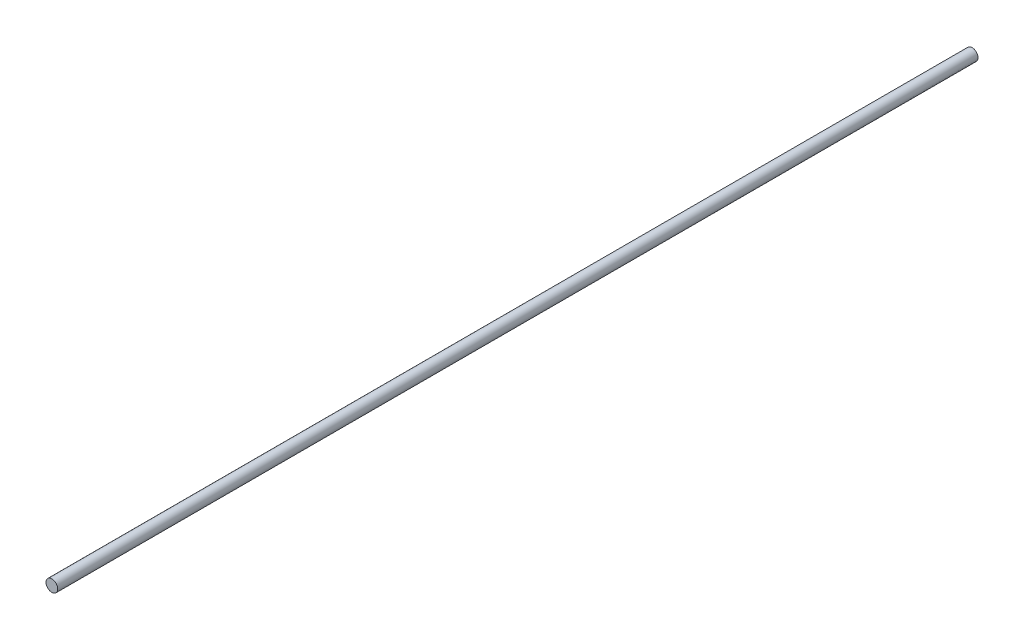
ISO-10303-21;
HEADER;
FILE_DESCRIPTION(('STEP AP214'),'2;1');
FILE_NAME('part.step','',(''),(''),'','','');
FILE_SCHEMA(('AUTOMOTIVE_DESIGN { 1 0 10303 214 1 1 1 1 }'));
ENDSEC;
DATA;
#1=APPLICATION_CONTEXT('core data for automotive mechanical design processes');
#2=APPLICATION_PROTOCOL_DEFINITION('international standard','automotive_design',2000,#1);
#3=PRODUCT_CONTEXT('',#1,'mechanical');
#4=PRODUCT('Part','Part','',(#3));
#5=PRODUCT_RELATED_PRODUCT_CATEGORY('part','',(#4));
#6=PRODUCT_DEFINITION_FORMATION('','',#4);
#7=PRODUCT_DEFINITION_CONTEXT('part definition',#1,'design');
#8=PRODUCT_DEFINITION('design','',#6,#7);
#9=PRODUCT_DEFINITION_SHAPE('','',#8);
#10=(LENGTH_UNIT() NAMED_UNIT(*) SI_UNIT(.MILLI.,.METRE.));
#11=(NAMED_UNIT(*) PLANE_ANGLE_UNIT() SI_UNIT($,.RADIAN.));
#12=(NAMED_UNIT(*) SI_UNIT($,.STERADIAN.) SOLID_ANGLE_UNIT());
#13=UNCERTAINTY_MEASURE_WITH_UNIT(LENGTH_MEASURE(1.E-05),#10,'distance_accuracy_value','');
#14=(GEOMETRIC_REPRESENTATION_CONTEXT(3) GLOBAL_UNCERTAINTY_ASSIGNED_CONTEXT((#13)) GLOBAL_UNIT_ASSIGNED_CONTEXT((#10,
#11,#12)) REPRESENTATION_CONTEXT('',''));
#15=CARTESIAN_POINT('',(0.,0.,0.));
#16=DIRECTION('',(0.,0.,1.));
#17=DIRECTION('',(1.,0.,0.));
#18=AXIS2_PLACEMENT_3D('',#15,#16,#17);
#19=CARTESIAN_POINT('',(0.,0.,785.));
#20=DIRECTION('',(0.,0.,-1.));
#21=DIRECTION('',(-1.,0.,0.));
#22=AXIS2_PLACEMENT_3D('',#19,#20,#21);
#23=CYLINDRICAL_SURFACE('',#22,5.);
#24=CARTESIAN_POINT('',(0.,0.,785.));
#25=DIRECTION('',(0.,0.,1.));
#26=DIRECTION('',(1.,0.,0.));
#27=AXIS2_PLACEMENT_3D('',#24,#25,#26);
#28=CIRCLE('',#27,5.);
#29=CARTESIAN_POINT('',(5.,0.,785.));
#30=VERTEX_POINT('',#29);
#31=EDGE_CURVE('E10',#30,#30,#28,.T.);
#32=ORIENTED_EDGE('',*,*,#31,.F.);
#33=EDGE_LOOP('',(#32));
#34=FACE_BOUND('',#33,.T.);
#35=CARTESIAN_POINT('',(0.,0.,0.));
#36=DIRECTION('',(0.,0.,1.));
#37=DIRECTION('',(1.,0.,0.));
#38=AXIS2_PLACEMENT_3D('',#35,#36,#37);
#39=CIRCLE('',#38,5.);
#40=CARTESIAN_POINT('',(5.,0.,0.));
#41=VERTEX_POINT('',#40);
#42=EDGE_CURVE('E34',#41,#41,#39,.T.);
#43=ORIENTED_EDGE('',*,*,#42,.T.);
#44=EDGE_LOOP('',(#43));
#45=FACE_BOUND('',#44,.T.);
#46=ADVANCED_FACE('F31',(#34,#45),#23,.T.);
#47=CARTESIAN_POINT('',(0.,0.,785.));
#48=DIRECTION('',(0.,0.,1.));
#49=DIRECTION('',(1.,0.,0.));
#50=AXIS2_PLACEMENT_3D('',#47,#48,#49);
#51=PLANE('',#50);
#52=ORIENTED_EDGE('',*,*,#31,.T.);
#53=EDGE_LOOP('',(#52));
#54=FACE_BOUND('',#53,.T.);
#55=ADVANCED_FACE('F46',(#54),#51,.T.);
#56=CARTESIAN_POINT('',(0.,0.,0.));
#57=DIRECTION('',(0.,0.,1.));
#58=DIRECTION('',(1.,0.,0.));
#59=AXIS2_PLACEMENT_3D('',#56,#57,#58);
#60=PLANE('',#59);
#61=ORIENTED_EDGE('',*,*,#42,.F.);
#62=EDGE_LOOP('',(#61));
#63=FACE_BOUND('',#62,.T.);
#64=ADVANCED_FACE('F44',(#63),#60,.F.);
#65=CLOSED_SHELL('',(#46,#55,#64));
#66=MANIFOLD_SOLID_BREP('B2',#65);
#67=ADVANCED_BREP_SHAPE_REPRESENTATION('',(#18,#66),#14);
#68=SHAPE_DEFINITION_REPRESENTATION(#9,#67);
ENDSEC;
END-ISO-10303-21;
